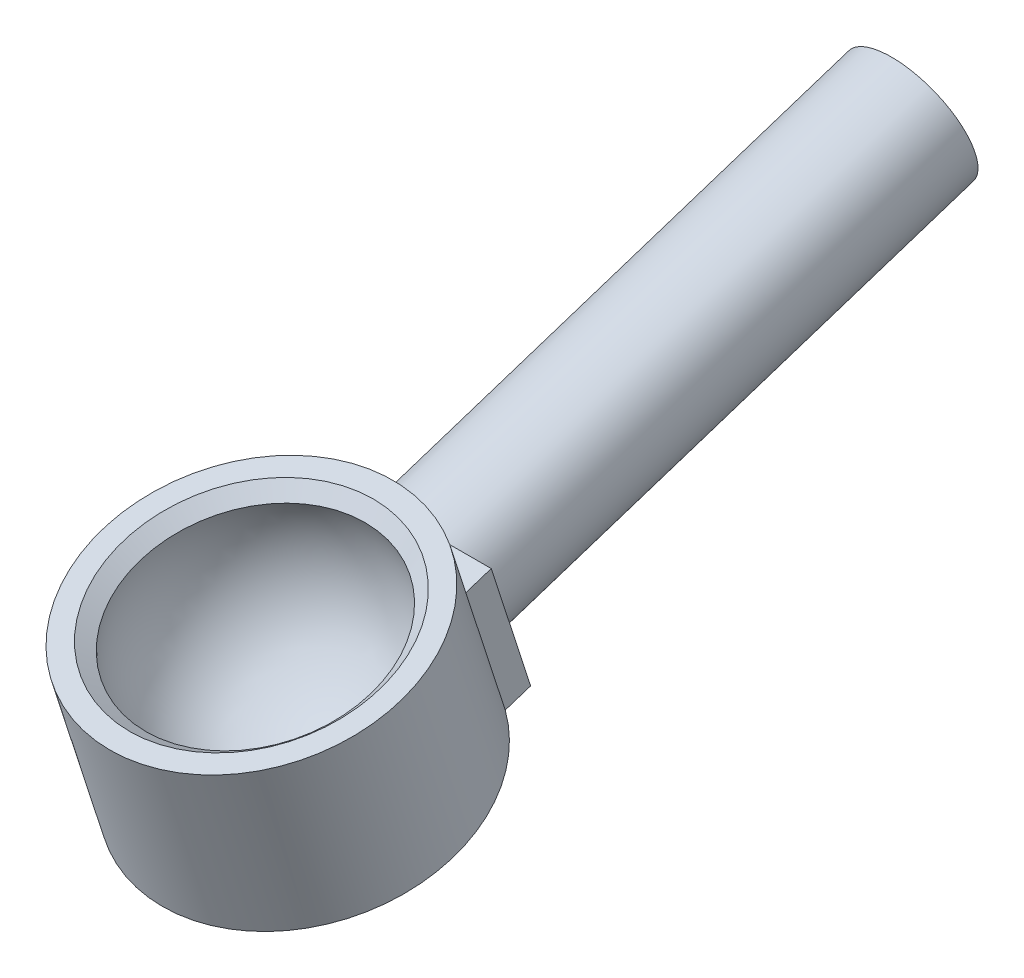
ISO-10303-21;
HEADER;
FILE_DESCRIPTION(('STEP AP214'),'2;1');
FILE_NAME('part.step','',(''),(''),'','','');
FILE_SCHEMA(('AUTOMOTIVE_DESIGN { 1 0 10303 214 1 1 1 1 }'));
ENDSEC;
DATA;
#1=APPLICATION_CONTEXT('core data for automotive mechanical design processes');
#2=APPLICATION_PROTOCOL_DEFINITION('international standard','automotive_design',2000,#1);
#3=PRODUCT_CONTEXT('',#1,'mechanical');
#4=PRODUCT('Part','Part','',(#3));
#5=PRODUCT_RELATED_PRODUCT_CATEGORY('part','',(#4));
#6=PRODUCT_DEFINITION_FORMATION('','',#4);
#7=PRODUCT_DEFINITION_CONTEXT('part definition',#1,'design');
#8=PRODUCT_DEFINITION('design','',#6,#7);
#9=PRODUCT_DEFINITION_SHAPE('','',#8);
#10=(LENGTH_UNIT() NAMED_UNIT(*) SI_UNIT(.MILLI.,.METRE.));
#11=(NAMED_UNIT(*) PLANE_ANGLE_UNIT() SI_UNIT($,.RADIAN.));
#12=(NAMED_UNIT(*) SI_UNIT($,.STERADIAN.) SOLID_ANGLE_UNIT());
#13=UNCERTAINTY_MEASURE_WITH_UNIT(LENGTH_MEASURE(1.E-05),#10,'distance_accuracy_value','');
#14=(GEOMETRIC_REPRESENTATION_CONTEXT(3) GLOBAL_UNCERTAINTY_ASSIGNED_CONTEXT((#13)) GLOBAL_UNIT_ASSIGNED_CONTEXT((#10,
#11,#12)) REPRESENTATION_CONTEXT('',''));
#15=CARTESIAN_POINT('',(0.,0.,0.));
#16=DIRECTION('',(0.,0.,1.));
#17=DIRECTION('',(1.,0.,0.));
#18=AXIS2_PLACEMENT_3D('',#15,#16,#17);
#19=CARTESIAN_POINT('',(188.94147151858,-331.307919233057,618.394731155563));
#20=DIRECTION('',(0.,-0.951056516295153,-0.30901699437495));
#21=DIRECTION('',(0.,0.30901699437495,-0.951056516295153));
#22=AXIS2_PLACEMENT_3D('',#19,#20,#21);
#23=PLANE('',#22);
#24=DIRECTION('',(-1.,0.,0.));
#25=VECTOR('',#24,1.);
#26=CARTESIAN_POINT('',(188.94147151858,-322.037409401808,589.863035666708));
#27=LINE('',#26,#25);
#28=CARTESIAN_POINT('',(188.94147151858,-322.037409401808,589.863035666708));
#29=VERTEX_POINT('',#28);
#30=CARTESIAN_POINT('',(178.94147151858,-322.037409401808,589.863035666708));
#31=VERTEX_POINT('',#30);
#32=EDGE_CURVE('E122',#29,#31,#27,.T.);
#33=ORIENTED_EDGE('',*,*,#32,.T.);
#34=CARTESIAN_POINT('',(178.941471518579,-327.44520680337,606.506524701873));
#35=DIRECTION('',(0.,-0.951056516295153,-0.30901699437495));
#36=DIRECTION('',(0.,0.30901699437495,-0.951056516295153));
#37=AXIS2_PLACEMENT_3D('',#34,#35,#36);
#38=CIRCLE('',#37,17.4999999999999);
#39=CARTESIAN_POINT('',(188.94147151858,-323.00728809579,592.848015356234));
#40=VERTEX_POINT('',#39);
#41=EDGE_CURVE('E136',#31,#40,#38,.T.);
#42=ORIENTED_EDGE('',*,*,#41,.T.);
#43=DIRECTION('',(0.,0.30901699437495,-0.951056516295153));
#44=VECTOR('',#43,1.);
#45=CARTESIAN_POINT('',(188.94147151858,-331.307919233057,618.394731155563));
#46=LINE('',#45,#44);
#47=EDGE_CURVE('E126',#40,#29,#46,.T.);
#48=ORIENTED_EDGE('',*,*,#47,.T.);
#49=EDGE_LOOP('',(#33,#42,#48));
#50=FACE_BOUND('',#49,.T.);
#51=ADVANCED_FACE('F41',(#50),#23,.F.);
#52=CARTESIAN_POINT('',(178.94147151858,-310.629313611525,530.482017231187));
#53=DIRECTION('',(0.,-0.30901699437495,0.951056516295153));
#54=DIRECTION('',(0.,-0.951056516295153,-0.30901699437495));
#55=AXIS2_PLACEMENT_3D('',#52,#53,#54);
#56=CYLINDRICAL_SURFACE('',#55,7.5);
#57=CARTESIAN_POINT('',(178.94147151858,-310.629313611525,530.482017231187));
#58=DIRECTION('',(0.,-0.30901699437495,0.951056516295153));
#59=DIRECTION('',(0.,-0.951056516295153,-0.30901699437495));
#60=AXIS2_PLACEMENT_3D('',#57,#58,#59);
#61=CIRCLE('',#60,7.5);
#62=CARTESIAN_POINT('',(178.94147151858,-317.762237483738,528.164389773375));
#63=VERTEX_POINT('',#62);
#64=EDGE_CURVE('E132',#63,#63,#61,.T.);
#65=ORIENTED_EDGE('',*,*,#64,.T.);
#66=EDGE_LOOP('',(#65));
#67=FACE_BOUND('',#66,.T.);
#68=CARTESIAN_POINT('',(178.94147151858,-329.170333274022,587.545408208896));
#69=DIRECTION('',(0.,-0.30901699437495,0.951056516295153));
#70=DIRECTION('',(0.,-0.951056516295153,-0.30901699437495));
#71=AXIS2_PLACEMENT_3D('',#68,#69,#70);
#72=CIRCLE('',#71,7.5);
#73=CARTESIAN_POINT('',(178.94147151858,-336.303257146235,585.227780751084));
#74=VERTEX_POINT('',#73);
#75=EDGE_CURVE('E129',#74,#31,#72,.T.);
#76=ORIENTED_EDGE('',*,*,#75,.F.);
#77=EDGE_CURVE('E96',#31,#74,#72,.T.);
#78=ORIENTED_EDGE('',*,*,#77,.F.);
#79=EDGE_LOOP('',(#76,#78));
#80=FACE_BOUND('',#79,.T.);
#81=ADVANCED_FACE('F171',(#67,#80),#56,.T.);
#82=CARTESIAN_POINT('',(178.94147151858,-310.629313611525,530.482017231187));
#83=DIRECTION('',(0.,-0.30901699437495,0.951056516295153));
#84=DIRECTION('',(0.,-0.951056516295153,-0.30901699437495));
#85=AXIS2_PLACEMENT_3D('',#82,#83,#84);
#86=PLANE('',#85);
#87=ORIENTED_EDGE('',*,*,#64,.F.);
#88=EDGE_LOOP('',(#87));
#89=FACE_BOUND('',#88,.T.);
#90=ADVANCED_FACE('F176',(#89),#86,.F.);
#91=CARTESIAN_POINT('',(-5.66514148937258E-13,-204.108232804316,628.180547903763));
#92=DIRECTION('',(0.,-0.309016994374954,0.951056516295152));
#93=DIRECTION('',(0.,-0.951056516295152,-0.309016994374954));
#94=AXIS2_PLACEMENT_3D('',#91,#92,#93);
#95=PLANE('',#94);
#96=DIRECTION('',(1.,0.,0.));
#97=VECTOR('',#96,1.);
#98=CARTESIAN_POINT('',(188.94147151858,-336.303257146235,585.227780751084));
#99=LINE('',#98,#97);
#100=CARTESIAN_POINT('',(188.94147151858,-336.303257146235,585.227780751084));
#101=VERTEX_POINT('',#100);
#102=EDGE_CURVE('E108',#74,#101,#99,.T.);
#103=ORIENTED_EDGE('',*,*,#102,.F.);
#104=ORIENTED_EDGE('',*,*,#75,.T.);
#105=ORIENTED_EDGE('',*,*,#32,.F.);
#106=DIRECTION('',(0.,0.951056516295153,0.309016994374948));
#107=VECTOR('',#106,1.);
#108=CARTESIAN_POINT('',(188.94147151858,-336.303257146235,585.227780751084));
#109=LINE('',#108,#107);
#110=EDGE_CURVE('E107',#101,#29,#109,.T.);
#111=ORIENTED_EDGE('',*,*,#110,.F.);
#112=EDGE_LOOP('',(#103,#104,#105,#111));
#113=FACE_BOUND('',#112,.T.);
#114=ADVANCED_FACE('F179',(#113),#95,.F.);
#115=CARTESIAN_POINT('',(168.94147151858,-322.037409401808,589.863035666708));
#116=VERTEX_POINT('',#115);
#117=EDGE_CURVE('E121',#31,#116,#27,.T.);
#118=ORIENTED_EDGE('',*,*,#117,.F.);
#119=ORIENTED_EDGE('',*,*,#77,.T.);
#120=CARTESIAN_POINT('',(168.94147151858,-336.303257146235,585.227780751084));
#121=VERTEX_POINT('',#120);
#122=EDGE_CURVE('E93',#121,#74,#99,.T.);
#123=ORIENTED_EDGE('',*,*,#122,.F.);
#124=DIRECTION('',(0.,-0.951056516295152,-0.309016994374954));
#125=VECTOR('',#124,1.);
#126=CARTESIAN_POINT('',(168.94147151858,-336.303257146235,585.227780751084));
#127=LINE('',#126,#125);
#128=EDGE_CURVE('E104',#116,#121,#127,.T.);
#129=ORIENTED_EDGE('',*,*,#128,.F.);
#130=EDGE_LOOP('',(#118,#119,#123,#129));
#131=FACE_BOUND('',#130,.T.);
#132=ADVANCED_FACE('F103',(#131),#95,.F.);
#133=CARTESIAN_POINT('',(168.94147151858,-345.573766977484,613.759476239938));
#134=DIRECTION('',(1.,0.,0.));
#135=DIRECTION('',(0.,0.,-1.));
#136=AXIS2_PLACEMENT_3D('',#133,#134,#135);
#137=PLANE('',#136);
#138=DIRECTION('',(0.,0.30901699437495,-0.951056516295153));
#139=VECTOR('',#138,1.);
#140=CARTESIAN_POINT('',(168.94147151858,-345.573766977484,613.759476239938));
#141=LINE('',#140,#139);
#142=CARTESIAN_POINT('',(168.94147151858,-337.273135840217,588.212760440609));
#143=VERTEX_POINT('',#142);
#144=EDGE_CURVE('E57',#143,#121,#141,.T.);
#145=ORIENTED_EDGE('',*,*,#144,.F.);
#146=DIRECTION('',(0.,0.951056516295153,0.30901699437495));
#147=VECTOR('',#146,1.);
#148=CARTESIAN_POINT('',(168.94147151858,-337.273135840217,588.21276044061));
#149=LINE('',#148,#147);
#150=CARTESIAN_POINT('',(168.94147151858,-323.00728809579,592.848015356234));
#151=VERTEX_POINT('',#150);
#152=EDGE_CURVE('E114',#143,#151,#149,.T.);
#153=ORIENTED_EDGE('',*,*,#152,.T.);
#154=DIRECTION('',(0.,0.30901699437495,-0.951056516295153));
#155=VECTOR('',#154,1.);
#156=CARTESIAN_POINT('',(168.94147151858,-331.307919233057,618.394731155563));
#157=LINE('',#156,#155);
#158=EDGE_CURVE('E112',#151,#116,#157,.T.);
#159=ORIENTED_EDGE('',*,*,#158,.T.);
#160=ORIENTED_EDGE('',*,*,#128,.T.);
#161=EDGE_LOOP('',(#145,#153,#159,#160));
#162=FACE_BOUND('',#161,.T.);
#163=ADVANCED_FACE('F110',(#162),#137,.F.);
#164=CARTESIAN_POINT('',(188.94147151858,-345.573766977484,613.759476239939));
#165=DIRECTION('',(0.,0.951056516295153,0.30901699437495));
#166=DIRECTION('',(0.,-0.30901699437495,0.951056516295153));
#167=AXIS2_PLACEMENT_3D('',#164,#165,#166);
#168=PLANE('',#167);
#169=CARTESIAN_POINT('',(178.941471518579,-341.711054547797,601.871269786249));
#170=DIRECTION('',(0.,0.951056516295153,0.30901699437495));
#171=DIRECTION('',(0.,-0.30901699437495,0.951056516295153));
#172=AXIS2_PLACEMENT_3D('',#169,#170,#171);
#173=CIRCLE('',#172,17.4999999999999);
#174=CARTESIAN_POINT('',(188.94147151858,-337.273135840218,588.21276044061));
#175=VERTEX_POINT('',#174);
#176=EDGE_CURVE('E95',#143,#175,#173,.T.);
#177=ORIENTED_EDGE('',*,*,#176,.F.);
#178=ORIENTED_EDGE('',*,*,#144,.T.);
#179=ORIENTED_EDGE('',*,*,#122,.T.);
#180=ORIENTED_EDGE('',*,*,#102,.T.);
#181=DIRECTION('',(0.,0.30901699437495,-0.951056516295153));
#182=VECTOR('',#181,1.);
#183=CARTESIAN_POINT('',(188.94147151858,-345.573766977484,613.759476239939));
#184=LINE('',#183,#182);
#185=EDGE_CURVE('E97',#175,#101,#184,.T.);
#186=ORIENTED_EDGE('',*,*,#185,.F.);
#187=EDGE_LOOP('',(#177,#178,#179,#180,#186));
#188=FACE_BOUND('',#187,.T.);
#189=ADVANCED_FACE('F91',(#188),#168,.F.);
#190=CARTESIAN_POINT('',(188.94147151858,-345.573766977484,613.759476239939));
#191=DIRECTION('',(-1.,0.,0.));
#192=DIRECTION('',(0.,0.,1.));
#193=AXIS2_PLACEMENT_3D('',#190,#191,#192);
#194=PLANE('',#193);
#195=ORIENTED_EDGE('',*,*,#47,.F.);
#196=DIRECTION('',(0.,0.951056516295153,0.30901699437495));
#197=VECTOR('',#196,1.);
#198=CARTESIAN_POINT('',(188.94147151858,-337.273135840217,588.21276044061));
#199=LINE('',#198,#197);
#200=EDGE_CURVE('E65',#40,#175,#199,.F.);
#201=ORIENTED_EDGE('',*,*,#200,.T.);
#202=ORIENTED_EDGE('',*,*,#185,.T.);
#203=ORIENTED_EDGE('',*,*,#110,.T.);
#204=EDGE_LOOP('',(#195,#201,#202,#203));
#205=FACE_BOUND('',#204,.T.);
#206=ADVANCED_FACE('F145',(#205),#194,.F.);
#207=ORIENTED_EDGE('',*,*,#158,.F.);
#208=EDGE_CURVE('E135',#151,#31,#38,.T.);
#209=ORIENTED_EDGE('',*,*,#208,.T.);
#210=ORIENTED_EDGE('',*,*,#117,.T.);
#211=EDGE_LOOP('',(#207,#209,#210));
#212=FACE_BOUND('',#211,.T.);
#213=ADVANCED_FACE('F157',(#212),#23,.F.);
#214=CARTESIAN_POINT('',(178.941471518579,-341.711054547797,601.871269786249));
#215=DIRECTION('',(0.,0.951056516295153,0.30901699437495));
#216=DIRECTION('',(0.,-0.30901699437495,0.951056516295153));
#217=AXIS2_PLACEMENT_3D('',#214,#215,#216);
#218=CYLINDRICAL_SURFACE('',#217,17.4999999999999);
#219=CARTESIAN_POINT('',(178.941471518579,-322.689924221894,608.051609673748));
#220=DIRECTION('',(0.,0.951056516295153,0.30901699437495));
#221=DIRECTION('',(0.,-0.30901699437495,0.951056516295153));
#222=AXIS2_PLACEMENT_3D('',#219,#220,#221);
#223=CIRCLE('',#222,17.4999999999999);
#224=CARTESIAN_POINT('',(178.941471518579,-328.097721623455,624.695098708913));
#225=VERTEX_POINT('',#224);
#226=EDGE_CURVE('E148',#225,#225,#223,.T.);
#227=ORIENTED_EDGE('',*,*,#226,.F.);
#228=EDGE_LOOP('',(#227));
#229=FACE_BOUND('',#228,.T.);
#230=ORIENTED_EDGE('',*,*,#152,.F.);
#231=ORIENTED_EDGE('',*,*,#176,.T.);
#232=ORIENTED_EDGE('',*,*,#200,.F.);
#233=ORIENTED_EDGE('',*,*,#41,.F.);
#234=ORIENTED_EDGE('',*,*,#208,.F.);
#235=EDGE_LOOP('',(#230,#231,#232,#233,#234));
#236=FACE_BOUND('',#235,.T.);
#237=ADVANCED_FACE('F147',(#229,#236),#218,.T.);
#238=CARTESIAN_POINT('',(178.941471518579,-322.689924221894,608.051609673748));
#239=DIRECTION('',(0.,0.951056516295153,0.30901699437495));
#240=DIRECTION('',(0.,-0.30901699437495,0.951056516295153));
#241=AXIS2_PLACEMENT_3D('',#238,#239,#240);
#242=PLANE('',#241);
#243=CARTESIAN_POINT('',(178.94147151858,-322.689924221894,608.051609673748));
#244=DIRECTION('',(0.,0.951056516295153,0.30901699437495));
#245=DIRECTION('',(0.,-0.30901699437495,0.951056516295153));
#246=AXIS2_PLACEMENT_3D('',#243,#244,#245);
#247=CIRCLE('',#246,15.0766968306222);
#248=CARTESIAN_POINT('',(178.94147151858,-327.348879761595,622.390400438718));
#249=VERTEX_POINT('',#248);
#250=EDGE_CURVE('E11',#249,#249,#247,.F.);
#251=ORIENTED_EDGE('',*,*,#250,.T.);
#252=EDGE_LOOP('',(#251));
#253=FACE_BOUND('',#252,.T.);
#254=ORIENTED_EDGE('',*,*,#226,.T.);
#255=EDGE_LOOP('',(#254));
#256=FACE_BOUND('',#255,.T.);
#257=ADVANCED_FACE('F154',(#253,#256),#242,.T.);
#258=CARTESIAN_POINT('',(178.94147151858,-327.445206803369,606.506524701873));
#259=DIRECTION('',(0.,0.309016994374951,-0.951056516295153));
#260=DIRECTION('',(1.,0.,0.));
#261=AXIS2_PLACEMENT_3D('',#258,#259,#260);
#262=SPHERICAL_SURFACE('',#261,14.);
#263=CARTESIAN_POINT('',(178.94147151858,-327.445206803369,606.506524701873));
#264=DIRECTION('',(0.,-0.951056516295151,-0.309016994374957));
#265=DIRECTION('',(0.,0.309016994374957,-0.951056516295151));
#266=AXIS2_PLACEMENT_3D('',#263,#264,#265);
#267=SPHERICAL_SURFACE('',#266,14.);
#268=CARTESIAN_POINT('',(178.94147151858,-324.132583963569,607.582861108716));
#269=DIRECTION('',(0.,-0.951056516295151,-0.309016994374957));
#270=DIRECTION('',(0.,0.309016994374957,-0.951056516295151));
#271=AXIS2_PLACEMENT_3D('',#268,#269,#270);
#272=CIRCLE('',#271,13.5597946098212);
#273=CARTESIAN_POINT('',(178.94147151858,-319.9423769889,594.686730085421));
#274=VERTEX_POINT('',#273);
#275=EDGE_CURVE('E50',#274,#274,#272,.F.);
#276=ORIENTED_EDGE('',*,*,#275,.T.);
#277=EDGE_LOOP('',(#276));
#278=FACE_BOUND('',#277,.T.);
#279=ADVANCED_FACE('F164',(#278),#267,.F.);
#280=CARTESIAN_POINT('',(178.94147151858,-324.132583963569,607.582861108716));
#281=DIRECTION('',(0.,0.951056516295151,0.309016994374957));
#282=DIRECTION('',(0.,-0.309016994374957,0.951056516295151));
#283=AXIS2_PLACEMENT_3D('',#280,#281,#282);
#284=CONICAL_SURFACE('',#283,13.5597946098212,0.785398163397483);
#285=ORIENTED_EDGE('',*,*,#250,.F.);
#286=EDGE_LOOP('',(#285));
#287=FACE_BOUND('',#286,.T.);
#288=ORIENTED_EDGE('',*,*,#275,.F.);
#289=EDGE_LOOP('',(#288));
#290=FACE_BOUND('',#289,.T.);
#291=ADVANCED_FACE('F44',(#287,#290),#284,.F.);
#292=CLOSED_SHELL('',(#51,#81,#90,#114,#132,#163,#189,#206,#213,#237,#257,#279,#291));
#293=MANIFOLD_SOLID_BREP('B2',#292);
#294=ADVANCED_BREP_SHAPE_REPRESENTATION('',(#18,#293),#14);
#295=SHAPE_DEFINITION_REPRESENTATION(#9,#294);
ENDSEC;
END-ISO-10303-21;
